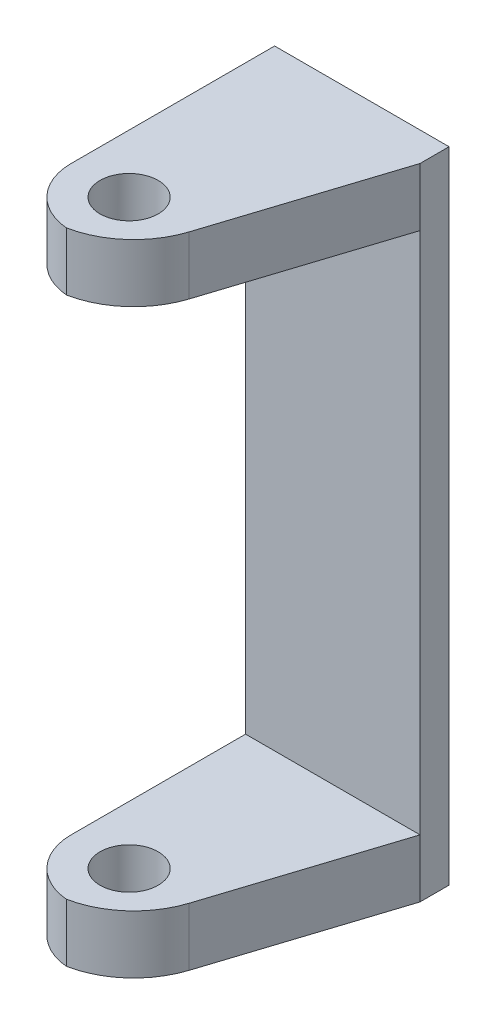
ISO-10303-21;
HEADER;
FILE_DESCRIPTION(('STEP AP214'),'2;1');
FILE_NAME('part.step','',(''),(''),'','','');
FILE_SCHEMA(('AUTOMOTIVE_DESIGN { 1 0 10303 214 1 1 1 1 }'));
ENDSEC;
DATA;
#1=APPLICATION_CONTEXT('core data for automotive mechanical design processes');
#2=APPLICATION_PROTOCOL_DEFINITION('international standard','automotive_design',2000,#1);
#3=PRODUCT_CONTEXT('',#1,'mechanical');
#4=PRODUCT('Part','Part','',(#3));
#5=PRODUCT_RELATED_PRODUCT_CATEGORY('part','',(#4));
#6=PRODUCT_DEFINITION_FORMATION('','',#4);
#7=PRODUCT_DEFINITION_CONTEXT('part definition',#1,'design');
#8=PRODUCT_DEFINITION('design','',#6,#7);
#9=PRODUCT_DEFINITION_SHAPE('','',#8);
#10=(LENGTH_UNIT() NAMED_UNIT(*) SI_UNIT(.MILLI.,.METRE.));
#11=(NAMED_UNIT(*) PLANE_ANGLE_UNIT() SI_UNIT($,.RADIAN.));
#12=(NAMED_UNIT(*) SI_UNIT($,.STERADIAN.) SOLID_ANGLE_UNIT());
#13=UNCERTAINTY_MEASURE_WITH_UNIT(LENGTH_MEASURE(1.E-05),#10,'distance_accuracy_value','');
#14=(GEOMETRIC_REPRESENTATION_CONTEXT(3) GLOBAL_UNCERTAINTY_ASSIGNED_CONTEXT((#13)) GLOBAL_UNIT_ASSIGNED_CONTEXT((#10,
#11,#12)) REPRESENTATION_CONTEXT('',''));
#15=CARTESIAN_POINT('',(0.,0.,0.));
#16=DIRECTION('',(0.,0.,1.));
#17=DIRECTION('',(1.,0.,0.));
#18=AXIS2_PLACEMENT_3D('',#15,#16,#17);
#19=CARTESIAN_POINT('',(0.,0.,5.));
#20=DIRECTION('',(1.,0.,0.));
#21=DIRECTION('',(0.,0.,-1.));
#22=AXIS2_PLACEMENT_3D('',#19,#20,#21);
#23=PLANE('',#22);
#24=DIRECTION('',(0.,0.,1.));
#25=VECTOR('',#24,1.);
#26=CARTESIAN_POINT('',(0.,9.99999999999999,5.));
#27=LINE('',#26,#25);
#28=CARTESIAN_POINT('',(0.,9.99999999999999,4.99999999999999));
#29=VERTEX_POINT('',#28);
#30=CARTESIAN_POINT('',(0.,9.99999999999999,35.031831765306));
#31=VERTEX_POINT('',#30);
#32=EDGE_CURVE('E180',#29,#31,#27,.T.);
#33=ORIENTED_EDGE('',*,*,#32,.F.);
#34=DIRECTION('',(0.,-1.,0.));
#35=VECTOR('',#34,1.);
#36=CARTESIAN_POINT('',(0.,0.,5.));
#37=LINE('',#36,#35);
#38=CARTESIAN_POINT('',(0.,100.,5.));
#39=VERTEX_POINT('',#38);
#40=EDGE_CURVE('E183',#39,#29,#37,.T.);
#41=ORIENTED_EDGE('',*,*,#40,.F.);
#42=DIRECTION('',(0.,0.,-1.));
#43=VECTOR('',#42,1.);
#44=CARTESIAN_POINT('',(0.,100.,5.));
#45=LINE('',#44,#43);
#46=CARTESIAN_POINT('',(0.,100.,35.031831765306));
#47=VERTEX_POINT('',#46);
#48=EDGE_CURVE('E164',#47,#39,#45,.T.);
#49=ORIENTED_EDGE('',*,*,#48,.F.);
#50=DIRECTION('',(0.,1.,0.));
#51=VECTOR('',#50,1.);
#52=CARTESIAN_POINT('',(0.,0.,35.031831765306));
#53=LINE('',#52,#51);
#54=CARTESIAN_POINT('',(0.,110.,35.031831765306));
#55=VERTEX_POINT('',#54);
#56=EDGE_CURVE('E207',#47,#55,#53,.T.);
#57=ORIENTED_EDGE('',*,*,#56,.T.);
#58=DIRECTION('',(0.,0.,-1.));
#59=VECTOR('',#58,1.);
#60=CARTESIAN_POINT('',(0.,110.,5.));
#61=LINE('',#60,#59);
#62=CARTESIAN_POINT('',(0.,110.,0.));
#63=VERTEX_POINT('',#62);
#64=EDGE_CURVE('E96',#55,#63,#61,.T.);
#65=ORIENTED_EDGE('',*,*,#64,.T.);
#66=DIRECTION('',(0.,-1.,0.));
#67=VECTOR('',#66,1.);
#68=CARTESIAN_POINT('',(0.,0.,0.));
#69=LINE('',#68,#67);
#70=CARTESIAN_POINT('',(0.,0.,0.));
#71=VERTEX_POINT('',#70);
#72=EDGE_CURVE('E87',#63,#71,#69,.T.);
#73=ORIENTED_EDGE('',*,*,#72,.T.);
#74=DIRECTION('',(0.,0.,-1.));
#75=VECTOR('',#74,1.);
#76=CARTESIAN_POINT('',(0.,0.,5.));
#77=LINE('',#76,#75);
#78=CARTESIAN_POINT('',(0.,0.,35.031831765306));
#79=VERTEX_POINT('',#78);
#80=EDGE_CURVE('E92',#79,#71,#77,.T.);
#81=ORIENTED_EDGE('',*,*,#80,.F.);
#82=EDGE_CURVE('E222',#79,#31,#53,.T.);
#83=ORIENTED_EDGE('',*,*,#82,.T.);
#84=EDGE_LOOP('',(#33,#41,#49,#57,#65,#73,#81,#83));
#85=FACE_BOUND('',#84,.T.);
#86=ADVANCED_FACE('F39',(#85),#23,.F.);
#87=CARTESIAN_POINT('',(20.3386610167256,0.,35.031831765306));
#88=DIRECTION('',(0.951952344514824,0.,0.306246197972693));
#89=DIRECTION('',(0.306246197972693,0.,-0.951952344514824));
#90=AXIS2_PLACEMENT_3D('',#87,#88,#89);
#91=PLANE('',#90);
#92=DIRECTION('',(0.,1.,0.));
#93=VECTOR('',#92,1.);
#94=CARTESIAN_POINT('',(30.,110.,5.));
#95=LINE('',#94,#93);
#96=CARTESIAN_POINT('',(30.,0.,5.));
#97=VERTEX_POINT('',#96);
#98=CARTESIAN_POINT('',(30.,9.99999999999999,4.99999999999999));
#99=VERTEX_POINT('',#98);
#100=EDGE_CURVE('E113',#97,#99,#95,.T.);
#101=ORIENTED_EDGE('',*,*,#100,.T.);
#102=DIRECTION('',(-0.306246197972693,0.,0.951952344514824));
#103=VECTOR('',#102,1.);
#104=CARTESIAN_POINT('',(20.3386610167256,9.99999999999999,35.031831765306));
#105=LINE('',#104,#103);
#106=CARTESIAN_POINT('',(20.3386610167256,9.99999999999999,35.031831765306));
#107=VERTEX_POINT('',#106);
#108=EDGE_CURVE('E176',#99,#107,#105,.T.);
#109=ORIENTED_EDGE('',*,*,#108,.T.);
#110=DIRECTION('',(0.,1.,0.));
#111=VECTOR('',#110,1.);
#112=CARTESIAN_POINT('',(20.3386610167256,0.,35.031831765306));
#113=LINE('',#112,#111);
#114=CARTESIAN_POINT('',(20.3386610167256,0.,35.031831765306));
#115=VERTEX_POINT('',#114);
#116=EDGE_CURVE('E118',#115,#107,#113,.T.);
#117=ORIENTED_EDGE('',*,*,#116,.F.);
#118=DIRECTION('',(0.306246197972693,0.,-0.951952344514824));
#119=VECTOR('',#118,1.);
#120=CARTESIAN_POINT('',(20.3386610167256,0.,35.031831765306));
#121=LINE('',#120,#119);
#122=EDGE_CURVE('E203',#115,#97,#121,.T.);
#123=ORIENTED_EDGE('',*,*,#122,.T.);
#124=EDGE_LOOP('',(#101,#109,#117,#123));
#125=FACE_BOUND('',#124,.T.);
#126=ADVANCED_FACE('F274',(#125),#91,.T.);
#127=CARTESIAN_POINT('',(20.3386610167256,100.,35.031831765306));
#128=VERTEX_POINT('',#127);
#129=CARTESIAN_POINT('',(20.3386610167256,110.,35.031831765306));
#130=VERTEX_POINT('',#129);
#131=EDGE_CURVE('E124',#128,#130,#113,.T.);
#132=ORIENTED_EDGE('',*,*,#131,.F.);
#133=DIRECTION('',(0.306246197972693,0.,-0.951952344514824));
#134=VECTOR('',#133,1.);
#135=CARTESIAN_POINT('',(20.3386610167256,100.,35.031831765306));
#136=LINE('',#135,#134);
#137=CARTESIAN_POINT('',(30.,100.,5.));
#138=VERTEX_POINT('',#137);
#139=EDGE_CURVE('E161',#128,#138,#136,.T.);
#140=ORIENTED_EDGE('',*,*,#139,.T.);
#141=CARTESIAN_POINT('',(30.,110.,5.));
#142=VERTEX_POINT('',#141);
#143=EDGE_CURVE('E66',#138,#142,#95,.T.);
#144=ORIENTED_EDGE('',*,*,#143,.T.);
#145=DIRECTION('',(0.306246197972693,0.,-0.951952344514824));
#146=VECTOR('',#145,1.);
#147=CARTESIAN_POINT('',(20.3386610167256,110.,35.031831765306));
#148=LINE('',#147,#146);
#149=EDGE_CURVE('E199',#130,#142,#148,.T.);
#150=ORIENTED_EDGE('',*,*,#149,.F.);
#151=EDGE_LOOP('',(#132,#140,#144,#150));
#152=FACE_BOUND('',#151,.T.);
#153=ADVANCED_FACE('F250',(#152),#91,.T.);
#154=CARTESIAN_POINT('',(6.25305757937574,0.,30.5004468449421));
#155=DIRECTION('',(0.,1.,0.));
#156=DIRECTION('',(0.,0.,1.));
#157=AXIS2_PLACEMENT_3D('',#154,#155,#156);
#158=CYLINDRICAL_SURFACE('',#157,14.7965426195035);
#159=ORIENTED_EDGE('',*,*,#116,.T.);
#160=CARTESIAN_POINT('',(6.25305757937574,9.99999999999999,30.5004468449421));
#161=DIRECTION('',(0.,1.,0.));
#162=DIRECTION('',(0.,0.,1.));
#163=AXIS2_PLACEMENT_3D('',#160,#161,#162);
#164=CIRCLE('',#163,14.7965426195035);
#165=CARTESIAN_POINT('',(9.20274091736901,9.99999999999999,45.));
#166=VERTEX_POINT('',#165);
#167=EDGE_CURVE('E172',#107,#166,#164,.F.);
#168=ORIENTED_EDGE('',*,*,#167,.T.);
#169=DIRECTION('',(0.,1.,0.));
#170=VECTOR('',#169,1.);
#171=CARTESIAN_POINT('',(9.20274091736901,0.,45.));
#172=LINE('',#171,#170);
#173=CARTESIAN_POINT('',(9.20274091736901,0.,45.));
#174=VERTEX_POINT('',#173);
#175=EDGE_CURVE('E218',#174,#166,#172,.T.);
#176=ORIENTED_EDGE('',*,*,#175,.F.);
#177=CARTESIAN_POINT('',(6.25305757937574,0.,30.5004468449421));
#178=DIRECTION('',(0.,1.,0.));
#179=DIRECTION('',(0.,0.,-1.));
#180=AXIS2_PLACEMENT_3D('',#177,#178,#179);
#181=CIRCLE('',#180,14.7965426195035);
#182=EDGE_CURVE('E198',#174,#115,#181,.T.);
#183=ORIENTED_EDGE('',*,*,#182,.T.);
#184=EDGE_LOOP('',(#159,#168,#176,#183));
#185=FACE_BOUND('',#184,.T.);
#186=ADVANCED_FACE('F277',(#185),#158,.T.);
#187=CARTESIAN_POINT('',(9.20274091736901,100.,45.));
#188=VERTEX_POINT('',#187);
#189=CARTESIAN_POINT('',(9.20274091736901,110.,45.));
#190=VERTEX_POINT('',#189);
#191=EDGE_CURVE('E221',#188,#190,#172,.T.);
#192=ORIENTED_EDGE('',*,*,#191,.F.);
#193=CARTESIAN_POINT('',(6.25305757937574,100.,30.5004468449421));
#194=DIRECTION('',(0.,-1.,0.));
#195=DIRECTION('',(0.,0.,-1.));
#196=AXIS2_PLACEMENT_3D('',#193,#194,#195);
#197=CIRCLE('',#196,14.7965426195035);
#198=EDGE_CURVE('E57',#188,#128,#197,.F.);
#199=ORIENTED_EDGE('',*,*,#198,.T.);
#200=ORIENTED_EDGE('',*,*,#131,.T.);
#201=CARTESIAN_POINT('',(6.25305757937574,110.,30.5004468449421));
#202=DIRECTION('',(0.,1.,0.));
#203=DIRECTION('',(0.,0.,-1.));
#204=AXIS2_PLACEMENT_3D('',#201,#202,#203);
#205=CIRCLE('',#204,14.7965426195035);
#206=EDGE_CURVE('E211',#190,#130,#205,.T.);
#207=ORIENTED_EDGE('',*,*,#206,.F.);
#208=EDGE_LOOP('',(#192,#199,#200,#207));
#209=FACE_BOUND('',#208,.T.);
#210=ADVANCED_FACE('F248',(#209),#158,.T.);
#211=CARTESIAN_POINT('',(10.,0.,35.031831765306));
#212=DIRECTION('',(0.,1.,0.));
#213=DIRECTION('',(0.,0.,1.));
#214=AXIS2_PLACEMENT_3D('',#211,#212,#213);
#215=CYLINDRICAL_SURFACE('',#214,10.);
#216=ORIENTED_EDGE('',*,*,#175,.T.);
#217=CARTESIAN_POINT('',(10.,9.99999999999999,35.031831765306));
#218=DIRECTION('',(0.,1.,0.));
#219=DIRECTION('',(0.,0.,1.));
#220=AXIS2_PLACEMENT_3D('',#217,#218,#219);
#221=CIRCLE('',#220,10.);
#222=EDGE_CURVE('E168',#166,#31,#221,.F.);
#223=ORIENTED_EDGE('',*,*,#222,.T.);
#224=ORIENTED_EDGE('',*,*,#82,.F.);
#225=CARTESIAN_POINT('',(10.,0.,35.031831765306));
#226=DIRECTION('',(0.,1.,0.));
#227=DIRECTION('',(0.,0.,1.));
#228=AXIS2_PLACEMENT_3D('',#225,#226,#227);
#229=CIRCLE('',#228,10.);
#230=EDGE_CURVE('E111',#79,#174,#229,.T.);
#231=ORIENTED_EDGE('',*,*,#230,.T.);
#232=EDGE_LOOP('',(#216,#223,#224,#231));
#233=FACE_BOUND('',#232,.T.);
#234=ADVANCED_FACE('F292',(#233),#215,.T.);
#235=ORIENTED_EDGE('',*,*,#56,.F.);
#236=CARTESIAN_POINT('',(10.,100.,35.031831765306));
#237=DIRECTION('',(0.,-1.,0.));
#238=DIRECTION('',(0.,0.,-1.));
#239=AXIS2_PLACEMENT_3D('',#236,#237,#238);
#240=CIRCLE('',#239,10.);
#241=EDGE_CURVE('E138',#47,#188,#240,.F.);
#242=ORIENTED_EDGE('',*,*,#241,.T.);
#243=ORIENTED_EDGE('',*,*,#191,.T.);
#244=CARTESIAN_POINT('',(10.,110.,35.031831765306));
#245=DIRECTION('',(0.,1.,0.));
#246=DIRECTION('',(0.,0.,1.));
#247=AXIS2_PLACEMENT_3D('',#244,#245,#246);
#248=CIRCLE('',#247,10.);
#249=EDGE_CURVE('E192',#55,#190,#248,.T.);
#250=ORIENTED_EDGE('',*,*,#249,.F.);
#251=EDGE_LOOP('',(#235,#242,#243,#250));
#252=FACE_BOUND('',#251,.T.);
#253=ADVANCED_FACE('F241',(#252),#215,.T.);
#254=CARTESIAN_POINT('',(10.,0.,35.031831765306));
#255=DIRECTION('',(0.,1.,0.));
#256=DIRECTION('',(0.,0.,1.));
#257=AXIS2_PLACEMENT_3D('',#254,#255,#256);
#258=CYLINDRICAL_SURFACE('',#257,5.);
#259=CARTESIAN_POINT('',(10.,0.,35.031831765306));
#260=DIRECTION('',(0.,1.,0.));
#261=DIRECTION('',(0.,0.,1.));
#262=AXIS2_PLACEMENT_3D('',#259,#260,#261);
#263=CIRCLE('',#262,5.);
#264=CARTESIAN_POINT('',(10.,0.,40.031831765306));
#265=VERTEX_POINT('',#264);
#266=EDGE_CURVE('E188',#265,#265,#263,.T.);
#267=ORIENTED_EDGE('',*,*,#266,.F.);
#268=EDGE_LOOP('',(#267));
#269=FACE_BOUND('',#268,.T.);
#270=CARTESIAN_POINT('',(10.,9.99999999999999,35.031831765306));
#271=DIRECTION('',(0.,1.,0.));
#272=DIRECTION('',(0.,0.,1.));
#273=AXIS2_PLACEMENT_3D('',#270,#271,#272);
#274=CIRCLE('',#273,5.);
#275=CARTESIAN_POINT('',(10.,9.99999999999999,40.031831765306));
#276=VERTEX_POINT('',#275);
#277=EDGE_CURVE('E43',#276,#276,#274,.F.);
#278=ORIENTED_EDGE('',*,*,#277,.F.);
#279=EDGE_LOOP('',(#278));
#280=FACE_BOUND('',#279,.T.);
#281=ADVANCED_FACE('F299',(#269,#280),#258,.F.);
#282=CARTESIAN_POINT('',(10.,110.,35.031831765306));
#283=DIRECTION('',(0.,1.,0.));
#284=DIRECTION('',(0.,0.,1.));
#285=AXIS2_PLACEMENT_3D('',#282,#283,#284);
#286=CIRCLE('',#285,5.);
#287=CARTESIAN_POINT('',(10.,110.,40.031831765306));
#288=VERTEX_POINT('',#287);
#289=EDGE_CURVE('E187',#288,#288,#286,.T.);
#290=ORIENTED_EDGE('',*,*,#289,.T.);
#291=EDGE_LOOP('',(#290));
#292=FACE_BOUND('',#291,.T.);
#293=CARTESIAN_POINT('',(10.,100.,35.031831765306));
#294=DIRECTION('',(0.,-1.,0.));
#295=DIRECTION('',(0.,0.,-1.));
#296=AXIS2_PLACEMENT_3D('',#293,#294,#295);
#297=CIRCLE('',#296,5.);
#298=CARTESIAN_POINT('',(10.,100.,30.031831765306));
#299=VERTEX_POINT('',#298);
#300=EDGE_CURVE('E135',#299,#299,#297,.F.);
#301=ORIENTED_EDGE('',*,*,#300,.F.);
#302=EDGE_LOOP('',(#301));
#303=FACE_BOUND('',#302,.T.);
#304=ADVANCED_FACE('F314',(#292,#303),#258,.F.);
#305=CARTESIAN_POINT('',(30.,0.,5.));
#306=DIRECTION('',(0.,1.,0.));
#307=DIRECTION('',(-1.,0.,0.));
#308=AXIS2_PLACEMENT_3D('',#305,#306,#307);
#309=PLANE('',#308);
#310=DIRECTION('',(1.,0.,0.));
#311=VECTOR('',#310,1.);
#312=CARTESIAN_POINT('',(30.,0.,0.));
#313=LINE('',#312,#311);
#314=CARTESIAN_POINT('',(30.,0.,0.));
#315=VERTEX_POINT('',#314);
#316=EDGE_CURVE('E108',#71,#315,#313,.T.);
#317=ORIENTED_EDGE('',*,*,#316,.T.);
#318=DIRECTION('',(0.,0.,-1.));
#319=VECTOR('',#318,1.);
#320=CARTESIAN_POINT('',(30.,0.,5.));
#321=LINE('',#320,#319);
#322=EDGE_CURVE('E11',#97,#315,#321,.T.);
#323=ORIENTED_EDGE('',*,*,#322,.F.);
#324=ORIENTED_EDGE('',*,*,#122,.F.);
#325=ORIENTED_EDGE('',*,*,#182,.F.);
#326=ORIENTED_EDGE('',*,*,#230,.F.);
#327=ORIENTED_EDGE('',*,*,#80,.T.);
#328=EDGE_LOOP('',(#317,#323,#324,#325,#326,#327));
#329=FACE_BOUND('',#328,.T.);
#330=ORIENTED_EDGE('',*,*,#266,.T.);
#331=EDGE_LOOP('',(#330));
#332=FACE_BOUND('',#331,.T.);
#333=ADVANCED_FACE('F41',(#329,#332),#309,.F.);
#334=CARTESIAN_POINT('',(30.,110.,5.));
#335=DIRECTION('',(-1.,0.,0.));
#336=DIRECTION('',(0.,-1.,0.));
#337=AXIS2_PLACEMENT_3D('',#334,#335,#336);
#338=PLANE('',#337);
#339=DIRECTION('',(0.,1.,0.));
#340=VECTOR('',#339,1.);
#341=CARTESIAN_POINT('',(30.,110.,0.));
#342=LINE('',#341,#340);
#343=CARTESIAN_POINT('',(30.,110.,0.));
#344=VERTEX_POINT('',#343);
#345=EDGE_CURVE('E116',#315,#344,#342,.T.);
#346=ORIENTED_EDGE('',*,*,#345,.T.);
#347=DIRECTION('',(0.,0.,-1.));
#348=VECTOR('',#347,1.);
#349=CARTESIAN_POINT('',(30.,110.,5.));
#350=LINE('',#349,#348);
#351=EDGE_CURVE('E49',#142,#344,#350,.T.);
#352=ORIENTED_EDGE('',*,*,#351,.F.);
#353=ORIENTED_EDGE('',*,*,#143,.F.);
#354=DIRECTION('',(0.,1.,0.));
#355=VECTOR('',#354,1.);
#356=CARTESIAN_POINT('',(30.,100.,5.));
#357=LINE('',#356,#355);
#358=EDGE_CURVE('E155',#99,#138,#357,.T.);
#359=ORIENTED_EDGE('',*,*,#358,.F.);
#360=ORIENTED_EDGE('',*,*,#100,.F.);
#361=ORIENTED_EDGE('',*,*,#322,.T.);
#362=EDGE_LOOP('',(#346,#352,#353,#359,#360,#361));
#363=FACE_BOUND('',#362,.T.);
#364=ADVANCED_FACE('F279',(#363),#338,.F.);
#365=CARTESIAN_POINT('',(0.,110.,5.));
#366=DIRECTION('',(0.,-1.,0.));
#367=DIRECTION('',(0.,0.,-1.));
#368=AXIS2_PLACEMENT_3D('',#365,#366,#367);
#369=PLANE('',#368);
#370=DIRECTION('',(-1.,0.,0.));
#371=VECTOR('',#370,1.);
#372=CARTESIAN_POINT('',(0.,110.,0.));
#373=LINE('',#372,#371);
#374=EDGE_CURVE('E101',#344,#63,#373,.T.);
#375=ORIENTED_EDGE('',*,*,#374,.T.);
#376=ORIENTED_EDGE('',*,*,#64,.F.);
#377=ORIENTED_EDGE('',*,*,#249,.T.);
#378=ORIENTED_EDGE('',*,*,#206,.T.);
#379=ORIENTED_EDGE('',*,*,#149,.T.);
#380=ORIENTED_EDGE('',*,*,#351,.T.);
#381=EDGE_LOOP('',(#375,#376,#377,#378,#379,#380));
#382=FACE_BOUND('',#381,.T.);
#383=ORIENTED_EDGE('',*,*,#289,.F.);
#384=EDGE_LOOP('',(#383));
#385=FACE_BOUND('',#384,.T.);
#386=ADVANCED_FACE('F239',(#382,#385),#369,.F.);
#387=CARTESIAN_POINT('',(0.,0.,0.));
#388=DIRECTION('',(0.,0.,-1.));
#389=DIRECTION('',(-1.,0.,0.));
#390=AXIS2_PLACEMENT_3D('',#387,#388,#389);
#391=PLANE('',#390);
#392=ORIENTED_EDGE('',*,*,#316,.F.);
#393=ORIENTED_EDGE('',*,*,#72,.F.);
#394=ORIENTED_EDGE('',*,*,#374,.F.);
#395=ORIENTED_EDGE('',*,*,#345,.F.);
#396=EDGE_LOOP('',(#392,#393,#394,#395));
#397=FACE_BOUND('',#396,.T.);
#398=ADVANCED_FACE('F115',(#397),#391,.T.);
#399=CARTESIAN_POINT('',(30.,100.,5.));
#400=DIRECTION('',(0.,0.,1.));
#401=DIRECTION('',(0.,-1.,0.));
#402=AXIS2_PLACEMENT_3D('',#399,#400,#401);
#403=PLANE('',#402);
#404=ORIENTED_EDGE('',*,*,#40,.T.);
#405=DIRECTION('',(-1.,0.,0.));
#406=VECTOR('',#405,1.);
#407=CARTESIAN_POINT('',(30.,9.99999999999999,4.99999999999999));
#408=LINE('',#407,#406);
#409=EDGE_CURVE('E139',#99,#29,#408,.T.);
#410=ORIENTED_EDGE('',*,*,#409,.F.);
#411=ORIENTED_EDGE('',*,*,#358,.T.);
#412=DIRECTION('',(-1.,0.,0.));
#413=VECTOR('',#412,1.);
#414=CARTESIAN_POINT('',(30.,100.,5.));
#415=LINE('',#414,#413);
#416=EDGE_CURVE('E146',#138,#39,#415,.T.);
#417=ORIENTED_EDGE('',*,*,#416,.T.);
#418=EDGE_LOOP('',(#404,#410,#411,#417));
#419=FACE_BOUND('',#418,.T.);
#420=ADVANCED_FACE('F289',(#419),#403,.T.);
#421=CARTESIAN_POINT('',(30.,9.99999999999999,4.99999999999999));
#422=DIRECTION('',(0.,1.,0.));
#423=DIRECTION('',(0.,0.,1.));
#424=AXIS2_PLACEMENT_3D('',#421,#422,#423);
#425=PLANE('',#424);
#426=ORIENTED_EDGE('',*,*,#277,.T.);
#427=EDGE_LOOP('',(#426));
#428=FACE_BOUND('',#427,.T.);
#429=ORIENTED_EDGE('',*,*,#32,.T.);
#430=ORIENTED_EDGE('',*,*,#222,.F.);
#431=ORIENTED_EDGE('',*,*,#167,.F.);
#432=ORIENTED_EDGE('',*,*,#108,.F.);
#433=ORIENTED_EDGE('',*,*,#409,.T.);
#434=EDGE_LOOP('',(#429,#430,#431,#432,#433));
#435=FACE_BOUND('',#434,.T.);
#436=ADVANCED_FACE('F290',(#428,#435),#425,.T.);
#437=CARTESIAN_POINT('',(30.,100.,45.));
#438=DIRECTION('',(0.,-1.,0.));
#439=DIRECTION('',(0.,0.,-1.));
#440=AXIS2_PLACEMENT_3D('',#437,#438,#439);
#441=PLANE('',#440);
#442=ORIENTED_EDGE('',*,*,#300,.T.);
#443=EDGE_LOOP('',(#442));
#444=FACE_BOUND('',#443,.T.);
#445=ORIENTED_EDGE('',*,*,#48,.T.);
#446=ORIENTED_EDGE('',*,*,#416,.F.);
#447=ORIENTED_EDGE('',*,*,#139,.F.);
#448=ORIENTED_EDGE('',*,*,#198,.F.);
#449=ORIENTED_EDGE('',*,*,#241,.F.);
#450=EDGE_LOOP('',(#445,#446,#447,#448,#449));
#451=FACE_BOUND('',#450,.T.);
#452=ADVANCED_FACE('F287',(#444,#451),#441,.T.);
#453=CLOSED_SHELL('',(#86,#126,#153,#186,#210,#234,#253,#281,#304,#333,#364,#386,#398,#420,#436,#452));
#454=MANIFOLD_SOLID_BREP('B2',#453);
#455=ADVANCED_BREP_SHAPE_REPRESENTATION('',(#18,#454),#14);
#456=SHAPE_DEFINITION_REPRESENTATION(#9,#455);
ENDSEC;
END-ISO-10303-21;
